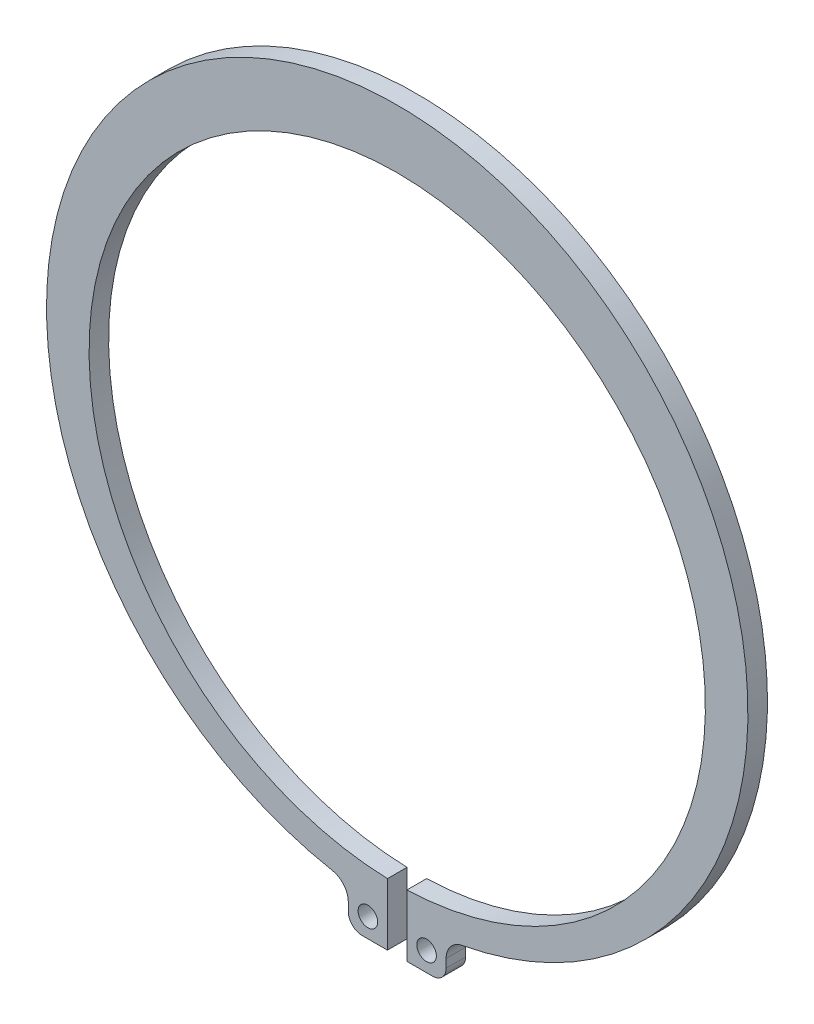
ISO-10303-21;
HEADER;
FILE_DESCRIPTION(('STEP AP214'),'2;1');
FILE_NAME('part.step','',(''),(''),'','','');
FILE_SCHEMA(('AUTOMOTIVE_DESIGN { 1 0 10303 214 1 1 1 1 }'));
ENDSEC;
DATA;
#1=APPLICATION_CONTEXT('core data for automotive mechanical design processes');
#2=APPLICATION_PROTOCOL_DEFINITION('international standard','automotive_design',2000,#1);
#3=PRODUCT_CONTEXT('',#1,'mechanical');
#4=PRODUCT('Part','Part','',(#3));
#5=PRODUCT_RELATED_PRODUCT_CATEGORY('part','',(#4));
#6=PRODUCT_DEFINITION_FORMATION('','',#4);
#7=PRODUCT_DEFINITION_CONTEXT('part definition',#1,'design');
#8=PRODUCT_DEFINITION('design','',#6,#7);
#9=PRODUCT_DEFINITION_SHAPE('','',#8);
#10=(LENGTH_UNIT() NAMED_UNIT(*) SI_UNIT(.MILLI.,.METRE.));
#11=(NAMED_UNIT(*) PLANE_ANGLE_UNIT() SI_UNIT($,.RADIAN.));
#12=(NAMED_UNIT(*) SI_UNIT($,.STERADIAN.) SOLID_ANGLE_UNIT());
#13=UNCERTAINTY_MEASURE_WITH_UNIT(LENGTH_MEASURE(1.E-05),#10,'distance_accuracy_value','');
#14=(GEOMETRIC_REPRESENTATION_CONTEXT(3) GLOBAL_UNCERTAINTY_ASSIGNED_CONTEXT((#13)) GLOBAL_UNIT_ASSIGNED_CONTEXT((#10,
#11,#12)) REPRESENTATION_CONTEXT('',''));
#15=CARTESIAN_POINT('',(0.,0.,0.));
#16=DIRECTION('',(0.,0.,1.));
#17=DIRECTION('',(1.,0.,0.));
#18=AXIS2_PLACEMENT_3D('',#15,#16,#17);
#19=CARTESIAN_POINT('',(0.,0.,3.));
#20=DIRECTION('',(0.,0.,1.));
#21=DIRECTION('',(1.,0.,0.));
#22=AXIS2_PLACEMENT_3D('',#19,#20,#21);
#23=PLANE('',#22);
#24=CARTESIAN_POINT('',(-4.49999999999999,-53.7503017426043,3.));
#25=DIRECTION('',(0.,0.,1.));
#26=DIRECTION('',(1.,0.,0.));
#27=AXIS2_PLACEMENT_3D('',#24,#25,#26);
#28=CIRCLE('',#27,1.5);
#29=CARTESIAN_POINT('',(-2.99999999999999,-53.7503017426043,3.));
#30=VERTEX_POINT('',#29);
#31=EDGE_CURVE('E217',#30,#30,#28,.T.);
#32=ORIENTED_EDGE('',*,*,#31,.F.);
#33=EDGE_LOOP('',(#32));
#34=FACE_BOUND('',#33,.T.);
#35=DIRECTION('',(1.,0.,0.));
#36=VECTOR('',#35,1.);
#37=CARTESIAN_POINT('',(1.50000000000001,-56.7261844742935,3.));
#38=LINE('',#37,#36);
#39=CARTESIAN_POINT('',(1.50000000000001,-56.7261844742935,3.));
#40=VERTEX_POINT('',#39);
#41=CARTESIAN_POINT('',(5.40000000000001,-56.7261844742935,3.));
#42=VERTEX_POINT('',#41);
#43=EDGE_CURVE('E133',#40,#42,#38,.T.);
#44=ORIENTED_EDGE('',*,*,#43,.T.);
#45=CARTESIAN_POINT('',(5.40000000000001,-54.6261844742935,3.));
#46=DIRECTION('',(0.,0.,1.));
#47=DIRECTION('',(1.,0.,0.));
#48=AXIS2_PLACEMENT_3D('',#45,#46,#47);
#49=CIRCLE('',#48,2.1);
#50=CARTESIAN_POINT('',(7.50000000000001,-54.6261844742935,3.));
#51=VERTEX_POINT('',#50);
#52=EDGE_CURVE('E183',#42,#51,#49,.T.);
#53=ORIENTED_EDGE('',*,*,#52,.T.);
#54=DIRECTION('',(0.,1.,0.));
#55=VECTOR('',#54,1.);
#56=CARTESIAN_POINT('',(7.50000000000001,-56.7261844742935,3.));
#57=LINE('',#56,#55);
#58=CARTESIAN_POINT('',(7.50000000000001,-53.320614747039,3.));
#59=VERTEX_POINT('',#58);
#60=EDGE_CURVE('E237',#51,#59,#57,.T.);
#61=ORIENTED_EDGE('',*,*,#60,.T.);
#62=CARTESIAN_POINT('',(10.5,-53.320614747039,3.));
#63=DIRECTION('',(0.,0.,1.));
#64=DIRECTION('',(1.,0.,0.));
#65=AXIS2_PLACEMENT_3D('',#62,#63,#64);
#66=CIRCLE('',#65,3.);
#67=CARTESIAN_POINT('',(9.94517833553502,-50.3723656190581,3.));
#68=VERTEX_POINT('',#67);
#69=EDGE_CURVE('E167',#59,#68,#66,.F.);
#70=ORIENTED_EDGE('',*,*,#69,.T.);
#71=CARTESIAN_POINT('',(0.,2.475,3.));
#72=DIRECTION('',(0.,0.,1.));
#73=DIRECTION('',(1.,0.,0.));
#74=AXIS2_PLACEMENT_3D('',#71,#72,#73);
#75=CIRCLE('',#74,53.775);
#76=CARTESIAN_POINT('',(-9.945178335535,-50.3723656190581,3.));
#77=VERTEX_POINT('',#76);
#78=EDGE_CURVE('E235',#68,#77,#75,.T.);
#79=ORIENTED_EDGE('',*,*,#78,.T.);
#80=CARTESIAN_POINT('',(-10.5,-53.320614747039,3.));
#81=DIRECTION('',(0.,0.,1.));
#82=DIRECTION('',(1.,0.,0.));
#83=AXIS2_PLACEMENT_3D('',#80,#81,#82);
#84=CIRCLE('',#83,3.);
#85=CARTESIAN_POINT('',(-7.5,-53.320614747039,3.));
#86=VERTEX_POINT('',#85);
#87=EDGE_CURVE('E171',#77,#86,#84,.F.);
#88=ORIENTED_EDGE('',*,*,#87,.T.);
#89=DIRECTION('',(0.,-1.,0.));
#90=VECTOR('',#89,1.);
#91=CARTESIAN_POINT('',(-7.5,-56.7261844742935,3.));
#92=LINE('',#91,#90);
#93=CARTESIAN_POINT('',(-7.5,-54.6261844742935,3.));
#94=VERTEX_POINT('',#93);
#95=EDGE_CURVE('E211',#86,#94,#92,.T.);
#96=ORIENTED_EDGE('',*,*,#95,.T.);
#97=CARTESIAN_POINT('',(-5.4,-54.6261844742935,3.));
#98=DIRECTION('',(0.,0.,1.));
#99=DIRECTION('',(1.,0.,0.));
#100=AXIS2_PLACEMENT_3D('',#97,#98,#99);
#101=CIRCLE('',#100,2.1);
#102=CARTESIAN_POINT('',(-5.4,-56.7261844742935,3.));
#103=VERTEX_POINT('',#102);
#104=EDGE_CURVE('E49',#94,#103,#101,.T.);
#105=ORIENTED_EDGE('',*,*,#104,.T.);
#106=DIRECTION('',(1.,0.,0.));
#107=VECTOR('',#106,1.);
#108=CARTESIAN_POINT('',(-1.49999999999999,-56.7261844742935,3.));
#109=LINE('',#108,#107);
#110=CARTESIAN_POINT('',(-1.49999999999999,-56.7261844742935,3.));
#111=VERTEX_POINT('',#110);
#112=EDGE_CURVE('E192',#103,#111,#109,.T.);
#113=ORIENTED_EDGE('',*,*,#112,.T.);
#114=DIRECTION('',(0.,1.,0.));
#115=VECTOR('',#114,1.);
#116=CARTESIAN_POINT('',(-1.49999999999999,-47.2261844742935,3.));
#117=LINE('',#116,#115);
#118=CARTESIAN_POINT('',(-1.49999999999999,-47.2261844742935,3.));
#119=VERTEX_POINT('',#118);
#120=EDGE_CURVE('E139',#111,#119,#117,.T.);
#121=ORIENTED_EDGE('',*,*,#120,.T.);
#122=CARTESIAN_POINT('',(0.,0.,3.));
#123=DIRECTION('',(0.,0.,-1.));
#124=DIRECTION('',(1.,0.,0.));
#125=AXIS2_PLACEMENT_3D('',#122,#123,#124);
#126=CIRCLE('',#125,47.25);
#127=CARTESIAN_POINT('',(1.50000000000001,-47.2261844742935,3.));
#128=VERTEX_POINT('',#127);
#129=EDGE_CURVE('E134',#119,#128,#126,.T.);
#130=ORIENTED_EDGE('',*,*,#129,.T.);
#131=DIRECTION('',(0.,-1.,0.));
#132=VECTOR('',#131,1.);
#133=CARTESIAN_POINT('',(1.50000000000001,-47.2261844742935,3.));
#134=LINE('',#133,#132);
#135=EDGE_CURVE('E123',#128,#40,#134,.T.);
#136=ORIENTED_EDGE('',*,*,#135,.T.);
#137=EDGE_LOOP('',(#44,#53,#61,#70,#79,#88,#96,#105,#113,#121,#130,#136));
#138=FACE_BOUND('',#137,.T.);
#139=CARTESIAN_POINT('',(4.50000000000001,-53.7503017426043,3.));
#140=DIRECTION('',(0.,0.,1.));
#141=DIRECTION('',(-1.,0.,0.));
#142=AXIS2_PLACEMENT_3D('',#139,#140,#141);
#143=CIRCLE('',#142,1.5);
#144=CARTESIAN_POINT('',(3.00000000000001,-53.7503017426043,3.));
#145=VERTEX_POINT('',#144);
#146=EDGE_CURVE('E245',#145,#145,#143,.T.);
#147=ORIENTED_EDGE('',*,*,#146,.F.);
#148=EDGE_LOOP('',(#147));
#149=FACE_BOUND('',#148,.T.);
#150=ADVANCED_FACE('F34',(#34,#138,#149),#23,.T.);
#151=CARTESIAN_POINT('',(0.,0.,0.));
#152=DIRECTION('',(0.,0.,1.));
#153=DIRECTION('',(1.,0.,0.));
#154=AXIS2_PLACEMENT_3D('',#151,#152,#153);
#155=PLANE('',#154);
#156=DIRECTION('',(0.,1.,0.));
#157=VECTOR('',#156,1.);
#158=CARTESIAN_POINT('',(7.50000000000001,-56.7261844742935,0.));
#159=LINE('',#158,#157);
#160=CARTESIAN_POINT('',(7.50000000000001,-54.6261844742935,0.));
#161=VERTEX_POINT('',#160);
#162=CARTESIAN_POINT('',(7.50000000000001,-53.320614747039,0.));
#163=VERTEX_POINT('',#162);
#164=EDGE_CURVE('E222',#161,#163,#159,.T.);
#165=ORIENTED_EDGE('',*,*,#164,.F.);
#166=CARTESIAN_POINT('',(5.40000000000001,-54.6261844742935,0.));
#167=DIRECTION('',(0.,0.,1.));
#168=DIRECTION('',(1.,0.,0.));
#169=AXIS2_PLACEMENT_3D('',#166,#167,#168);
#170=CIRCLE('',#169,2.1);
#171=CARTESIAN_POINT('',(5.40000000000001,-56.7261844742935,0.));
#172=VERTEX_POINT('',#171);
#173=EDGE_CURVE('E178',#161,#172,#170,.F.);
#174=ORIENTED_EDGE('',*,*,#173,.T.);
#175=DIRECTION('',(1.,0.,0.));
#176=VECTOR('',#175,1.);
#177=CARTESIAN_POINT('',(1.50000000000001,-56.7261844742935,0.));
#178=LINE('',#177,#176);
#179=CARTESIAN_POINT('',(1.50000000000001,-56.7261844742935,0.));
#180=VERTEX_POINT('',#179);
#181=EDGE_CURVE('E219',#180,#172,#178,.T.);
#182=ORIENTED_EDGE('',*,*,#181,.F.);
#183=DIRECTION('',(0.,-1.,0.));
#184=VECTOR('',#183,1.);
#185=CARTESIAN_POINT('',(1.50000000000001,-47.2261844742935,0.));
#186=LINE('',#185,#184);
#187=CARTESIAN_POINT('',(1.50000000000001,-47.2261844742935,0.));
#188=VERTEX_POINT('',#187);
#189=EDGE_CURVE('E216',#188,#180,#186,.T.);
#190=ORIENTED_EDGE('',*,*,#189,.F.);
#191=CARTESIAN_POINT('',(0.,0.,0.));
#192=DIRECTION('',(0.,0.,-1.));
#193=DIRECTION('',(1.,0.,0.));
#194=AXIS2_PLACEMENT_3D('',#191,#192,#193);
#195=CIRCLE('',#194,47.25);
#196=CARTESIAN_POINT('',(-1.49999999999999,-47.2261844742935,0.));
#197=VERTEX_POINT('',#196);
#198=EDGE_CURVE('E147',#197,#188,#195,.T.);
#199=ORIENTED_EDGE('',*,*,#198,.F.);
#200=DIRECTION('',(0.,1.,0.));
#201=VECTOR('',#200,1.);
#202=CARTESIAN_POINT('',(-1.49999999999999,-47.2261844742935,0.));
#203=LINE('',#202,#201);
#204=CARTESIAN_POINT('',(-1.49999999999999,-56.7261844742935,0.));
#205=VERTEX_POINT('',#204);
#206=EDGE_CURVE('E143',#205,#197,#203,.T.);
#207=ORIENTED_EDGE('',*,*,#206,.F.);
#208=DIRECTION('',(1.,0.,0.));
#209=VECTOR('',#208,1.);
#210=CARTESIAN_POINT('',(-1.49999999999999,-56.7261844742935,0.));
#211=LINE('',#210,#209);
#212=CARTESIAN_POINT('',(-5.4,-56.7261844742935,0.));
#213=VERTEX_POINT('',#212);
#214=EDGE_CURVE('E190',#213,#205,#211,.T.);
#215=ORIENTED_EDGE('',*,*,#214,.F.);
#216=CARTESIAN_POINT('',(-5.4,-54.6261844742935,0.));
#217=DIRECTION('',(0.,0.,1.));
#218=DIRECTION('',(1.,0.,0.));
#219=AXIS2_PLACEMENT_3D('',#216,#217,#218);
#220=CIRCLE('',#219,2.1);
#221=CARTESIAN_POINT('',(-7.5,-54.6261844742935,0.));
#222=VERTEX_POINT('',#221);
#223=EDGE_CURVE('E176',#213,#222,#220,.F.);
#224=ORIENTED_EDGE('',*,*,#223,.T.);
#225=DIRECTION('',(0.,-1.,0.));
#226=VECTOR('',#225,1.);
#227=CARTESIAN_POINT('',(-7.5,-56.7261844742935,0.));
#228=LINE('',#227,#226);
#229=CARTESIAN_POINT('',(-7.5,-53.320614747039,0.));
#230=VERTEX_POINT('',#229);
#231=EDGE_CURVE('E200',#230,#222,#228,.T.);
#232=ORIENTED_EDGE('',*,*,#231,.F.);
#233=CARTESIAN_POINT('',(-10.5,-53.320614747039,0.));
#234=DIRECTION('',(0.,0.,1.));
#235=DIRECTION('',(1.,0.,0.));
#236=AXIS2_PLACEMENT_3D('',#233,#234,#235);
#237=CIRCLE('',#236,3.);
#238=CARTESIAN_POINT('',(-9.945178335535,-50.3723656190581,0.));
#239=VERTEX_POINT('',#238);
#240=EDGE_CURVE('E169',#230,#239,#237,.T.);
#241=ORIENTED_EDGE('',*,*,#240,.T.);
#242=CARTESIAN_POINT('',(0.,2.475,0.));
#243=DIRECTION('',(0.,0.,1.));
#244=DIRECTION('',(1.,0.,0.));
#245=AXIS2_PLACEMENT_3D('',#242,#243,#244);
#246=CIRCLE('',#245,53.775);
#247=CARTESIAN_POINT('',(9.94517833553502,-50.3723656190581,0.));
#248=VERTEX_POINT('',#247);
#249=EDGE_CURVE('E203',#248,#239,#246,.T.);
#250=ORIENTED_EDGE('',*,*,#249,.F.);
#251=CARTESIAN_POINT('',(10.5,-53.320614747039,0.));
#252=DIRECTION('',(0.,0.,1.));
#253=DIRECTION('',(1.,0.,0.));
#254=AXIS2_PLACEMENT_3D('',#251,#252,#253);
#255=CIRCLE('',#254,3.);
#256=EDGE_CURVE('E164',#248,#163,#255,.T.);
#257=ORIENTED_EDGE('',*,*,#256,.T.);
#258=EDGE_LOOP('',(#165,#174,#182,#190,#199,#207,#215,#224,#232,#241,#250,#257));
#259=FACE_BOUND('',#258,.T.);
#260=CARTESIAN_POINT('',(-4.49999999999999,-53.7503017426043,0.));
#261=DIRECTION('',(0.,0.,1.));
#262=DIRECTION('',(1.,0.,0.));
#263=AXIS2_PLACEMENT_3D('',#260,#261,#262);
#264=CIRCLE('',#263,1.5);
#265=CARTESIAN_POINT('',(-2.99999999999999,-53.7503017426043,0.));
#266=VERTEX_POINT('',#265);
#267=EDGE_CURVE('E242',#266,#266,#264,.T.);
#268=ORIENTED_EDGE('',*,*,#267,.T.);
#269=EDGE_LOOP('',(#268));
#270=FACE_BOUND('',#269,.T.);
#271=CARTESIAN_POINT('',(4.50000000000001,-53.7503017426043,0.));
#272=DIRECTION('',(0.,0.,1.));
#273=DIRECTION('',(-1.,0.,0.));
#274=AXIS2_PLACEMENT_3D('',#271,#272,#273);
#275=CIRCLE('',#274,1.5);
#276=CARTESIAN_POINT('',(3.00000000000001,-53.7503017426043,0.));
#277=VERTEX_POINT('',#276);
#278=EDGE_CURVE('E248',#277,#277,#275,.T.);
#279=ORIENTED_EDGE('',*,*,#278,.T.);
#280=EDGE_LOOP('',(#279));
#281=FACE_BOUND('',#280,.T.);
#282=ADVANCED_FACE('F197',(#259,#270,#281),#155,.F.);
#283=CARTESIAN_POINT('',(0.,0.,3.));
#284=DIRECTION('',(0.,0.,-1.));
#285=DIRECTION('',(-1.,0.,0.));
#286=AXIS2_PLACEMENT_3D('',#283,#284,#285);
#287=CYLINDRICAL_SURFACE('',#286,47.25);
#288=ORIENTED_EDGE('',*,*,#198,.T.);
#289=DIRECTION('',(0.,0.,-1.));
#290=VECTOR('',#289,1.);
#291=CARTESIAN_POINT('',(1.50000000000001,-47.2261844742935,3.));
#292=LINE('',#291,#290);
#293=EDGE_CURVE('E127',#128,#188,#292,.T.);
#294=ORIENTED_EDGE('',*,*,#293,.F.);
#295=ORIENTED_EDGE('',*,*,#129,.F.);
#296=DIRECTION('',(0.,0.,-1.));
#297=VECTOR('',#296,1.);
#298=CARTESIAN_POINT('',(-1.49999999999999,-47.2261844742935,3.));
#299=LINE('',#298,#297);
#300=EDGE_CURVE('E207',#119,#197,#299,.T.);
#301=ORIENTED_EDGE('',*,*,#300,.T.);
#302=EDGE_LOOP('',(#288,#294,#295,#301));
#303=FACE_BOUND('',#302,.T.);
#304=ADVANCED_FACE('F145',(#303),#287,.F.);
#305=CARTESIAN_POINT('',(1.50000000000001,-47.2261844742935,3.));
#306=DIRECTION('',(1.,0.,0.));
#307=DIRECTION('',(0.,1.,0.));
#308=AXIS2_PLACEMENT_3D('',#305,#306,#307);
#309=PLANE('',#308);
#310=ORIENTED_EDGE('',*,*,#189,.T.);
#311=DIRECTION('',(0.,0.,-1.));
#312=VECTOR('',#311,1.);
#313=CARTESIAN_POINT('',(1.50000000000001,-56.7261844742935,3.));
#314=LINE('',#313,#312);
#315=EDGE_CURVE('E130',#40,#180,#314,.T.);
#316=ORIENTED_EDGE('',*,*,#315,.F.);
#317=ORIENTED_EDGE('',*,*,#135,.F.);
#318=ORIENTED_EDGE('',*,*,#293,.T.);
#319=EDGE_LOOP('',(#310,#316,#317,#318));
#320=FACE_BOUND('',#319,.T.);
#321=ADVANCED_FACE('F125',(#320),#309,.F.);
#322=CARTESIAN_POINT('',(1.50000000000001,-56.7261844742935,3.));
#323=DIRECTION('',(0.,1.,0.));
#324=DIRECTION('',(-1.,0.,0.));
#325=AXIS2_PLACEMENT_3D('',#322,#323,#324);
#326=PLANE('',#325);
#327=ORIENTED_EDGE('',*,*,#181,.T.);
#328=DIRECTION('',(0.,0.,-1.));
#329=VECTOR('',#328,1.);
#330=CARTESIAN_POINT('',(5.40000000000001,-56.7261844742935,3.));
#331=LINE('',#330,#329);
#332=EDGE_CURVE('E180',#172,#42,#331,.F.);
#333=ORIENTED_EDGE('',*,*,#332,.T.);
#334=ORIENTED_EDGE('',*,*,#43,.F.);
#335=ORIENTED_EDGE('',*,*,#315,.T.);
#336=EDGE_LOOP('',(#327,#333,#334,#335));
#337=FACE_BOUND('',#336,.T.);
#338=ADVANCED_FACE('F279',(#337),#326,.F.);
#339=CARTESIAN_POINT('',(7.50000000000001,-56.7261844742935,3.));
#340=DIRECTION('',(-1.,0.,0.));
#341=DIRECTION('',(0.,-1.,0.));
#342=AXIS2_PLACEMENT_3D('',#339,#340,#341);
#343=PLANE('',#342);
#344=ORIENTED_EDGE('',*,*,#60,.F.);
#345=DIRECTION('',(0.,0.,-1.));
#346=VECTOR('',#345,1.);
#347=CARTESIAN_POINT('',(7.50000000000001,-54.6261844742935,3.));
#348=LINE('',#347,#346);
#349=EDGE_CURVE('E173',#51,#161,#348,.T.);
#350=ORIENTED_EDGE('',*,*,#349,.T.);
#351=ORIENTED_EDGE('',*,*,#164,.T.);
#352=DIRECTION('',(0.,0.,1.));
#353=VECTOR('',#352,1.);
#354=CARTESIAN_POINT('',(7.50000000000001,-53.320614747039,3.));
#355=LINE('',#354,#353);
#356=EDGE_CURVE('E158',#163,#59,#355,.T.);
#357=ORIENTED_EDGE('',*,*,#356,.T.);
#358=EDGE_LOOP('',(#344,#350,#351,#357));
#359=FACE_BOUND('',#358,.T.);
#360=ADVANCED_FACE('F276',(#359),#343,.F.);
#361=CARTESIAN_POINT('',(0.,2.475,3.));
#362=DIRECTION('',(0.,0.,-1.));
#363=DIRECTION('',(-1.,0.,0.));
#364=AXIS2_PLACEMENT_3D('',#361,#362,#363);
#365=CYLINDRICAL_SURFACE('',#364,53.775);
#366=ORIENTED_EDGE('',*,*,#78,.F.);
#367=DIRECTION('',(0.,0.,-1.));
#368=VECTOR('',#367,1.);
#369=CARTESIAN_POINT('',(9.94517833553502,-50.3723656190581,3.));
#370=LINE('',#369,#368);
#371=EDGE_CURVE('E150',#68,#248,#370,.T.);
#372=ORIENTED_EDGE('',*,*,#371,.T.);
#373=ORIENTED_EDGE('',*,*,#249,.T.);
#374=DIRECTION('',(0.,0.,-1.));
#375=VECTOR('',#374,1.);
#376=CARTESIAN_POINT('',(-9.945178335535,-50.3723656190581,3.));
#377=LINE('',#376,#375);
#378=EDGE_CURVE('E148',#239,#77,#377,.F.);
#379=ORIENTED_EDGE('',*,*,#378,.T.);
#380=EDGE_LOOP('',(#366,#372,#373,#379));
#381=FACE_BOUND('',#380,.T.);
#382=ADVANCED_FACE('F228',(#381),#365,.T.);
#383=CARTESIAN_POINT('',(-7.5,-56.7261844742935,3.));
#384=DIRECTION('',(1.,0.,0.));
#385=DIRECTION('',(0.,1.,0.));
#386=AXIS2_PLACEMENT_3D('',#383,#384,#385);
#387=PLANE('',#386);
#388=ORIENTED_EDGE('',*,*,#231,.T.);
#389=DIRECTION('',(0.,0.,-1.));
#390=VECTOR('',#389,1.);
#391=CARTESIAN_POINT('',(-7.5,-54.6261844742935,3.));
#392=LINE('',#391,#390);
#393=EDGE_CURVE('E11',#222,#94,#392,.F.);
#394=ORIENTED_EDGE('',*,*,#393,.T.);
#395=ORIENTED_EDGE('',*,*,#95,.F.);
#396=DIRECTION('',(0.,0.,1.));
#397=VECTOR('',#396,1.);
#398=CARTESIAN_POINT('',(-7.5,-53.320614747039,0.));
#399=LINE('',#398,#397);
#400=EDGE_CURVE('E161',#86,#230,#399,.F.);
#401=ORIENTED_EDGE('',*,*,#400,.T.);
#402=EDGE_LOOP('',(#388,#394,#395,#401));
#403=FACE_BOUND('',#402,.T.);
#404=ADVANCED_FACE('F236',(#403),#387,.F.);
#405=CARTESIAN_POINT('',(-1.49999999999999,-56.7261844742935,3.));
#406=DIRECTION('',(0.,1.,0.));
#407=DIRECTION('',(0.,0.,1.));
#408=AXIS2_PLACEMENT_3D('',#405,#406,#407);
#409=PLANE('',#408);
#410=ORIENTED_EDGE('',*,*,#112,.F.);
#411=DIRECTION('',(0.,0.,-1.));
#412=VECTOR('',#411,1.);
#413=CARTESIAN_POINT('',(-5.4,-56.7261844742935,3.));
#414=LINE('',#413,#412);
#415=EDGE_CURVE('E42',#103,#213,#414,.T.);
#416=ORIENTED_EDGE('',*,*,#415,.T.);
#417=ORIENTED_EDGE('',*,*,#214,.T.);
#418=DIRECTION('',(0.,0.,-1.));
#419=VECTOR('',#418,1.);
#420=CARTESIAN_POINT('',(-1.49999999999999,-56.7261844742935,3.));
#421=LINE('',#420,#419);
#422=EDGE_CURVE('E152',#111,#205,#421,.T.);
#423=ORIENTED_EDGE('',*,*,#422,.F.);
#424=EDGE_LOOP('',(#410,#416,#417,#423));
#425=FACE_BOUND('',#424,.T.);
#426=ADVANCED_FACE('F188',(#425),#409,.F.);
#427=CARTESIAN_POINT('',(-1.49999999999999,-47.2261844742935,3.));
#428=DIRECTION('',(-1.,0.,0.));
#429=DIRECTION('',(0.,-1.,0.));
#430=AXIS2_PLACEMENT_3D('',#427,#428,#429);
#431=PLANE('',#430);
#432=ORIENTED_EDGE('',*,*,#206,.T.);
#433=ORIENTED_EDGE('',*,*,#300,.F.);
#434=ORIENTED_EDGE('',*,*,#120,.F.);
#435=ORIENTED_EDGE('',*,*,#422,.T.);
#436=EDGE_LOOP('',(#432,#433,#434,#435));
#437=FACE_BOUND('',#436,.T.);
#438=ADVANCED_FACE('F209',(#437),#431,.F.);
#439=CARTESIAN_POINT('',(-4.49999999999999,-53.7503017426043,3.));
#440=DIRECTION('',(0.,0.,-1.));
#441=DIRECTION('',(-1.,0.,0.));
#442=AXIS2_PLACEMENT_3D('',#439,#440,#441);
#443=CYLINDRICAL_SURFACE('',#442,1.5);
#444=ORIENTED_EDGE('',*,*,#31,.T.);
#445=EDGE_LOOP('',(#444));
#446=FACE_BOUND('',#445,.T.);
#447=ORIENTED_EDGE('',*,*,#267,.F.);
#448=EDGE_LOOP('',(#447));
#449=FACE_BOUND('',#448,.T.);
#450=ADVANCED_FACE('F265',(#446,#449),#443,.F.);
#451=CARTESIAN_POINT('',(4.50000000000001,-53.7503017426043,3.));
#452=DIRECTION('',(0.,0.,-1.));
#453=DIRECTION('',(-1.,0.,0.));
#454=AXIS2_PLACEMENT_3D('',#451,#452,#453);
#455=CYLINDRICAL_SURFACE('',#454,1.5);
#456=ORIENTED_EDGE('',*,*,#146,.T.);
#457=EDGE_LOOP('',(#456));
#458=FACE_BOUND('',#457,.T.);
#459=ORIENTED_EDGE('',*,*,#278,.F.);
#460=EDGE_LOOP('',(#459));
#461=FACE_BOUND('',#460,.T.);
#462=ADVANCED_FACE('F254',(#458,#461),#455,.F.);
#463=CARTESIAN_POINT('',(10.5,-53.320614747039,3.));
#464=DIRECTION('',(0.,0.,-1.));
#465=DIRECTION('',(-1.,0.,0.));
#466=AXIS2_PLACEMENT_3D('',#463,#464,#465);
#467=CYLINDRICAL_SURFACE('',#466,3.);
#468=ORIENTED_EDGE('',*,*,#69,.F.);
#469=ORIENTED_EDGE('',*,*,#356,.F.);
#470=ORIENTED_EDGE('',*,*,#256,.F.);
#471=ORIENTED_EDGE('',*,*,#371,.F.);
#472=EDGE_LOOP('',(#468,#469,#470,#471));
#473=FACE_BOUND('',#472,.T.);
#474=ADVANCED_FACE('F288',(#473),#467,.F.);
#475=CARTESIAN_POINT('',(-10.5,-53.320614747039,3.));
#476=DIRECTION('',(0.,0.,-1.));
#477=DIRECTION('',(-1.,0.,0.));
#478=AXIS2_PLACEMENT_3D('',#475,#476,#477);
#479=CYLINDRICAL_SURFACE('',#478,3.);
#480=ORIENTED_EDGE('',*,*,#87,.F.);
#481=ORIENTED_EDGE('',*,*,#378,.F.);
#482=ORIENTED_EDGE('',*,*,#240,.F.);
#483=ORIENTED_EDGE('',*,*,#400,.F.);
#484=EDGE_LOOP('',(#480,#481,#482,#483));
#485=FACE_BOUND('',#484,.T.);
#486=ADVANCED_FACE('F233',(#485),#479,.F.);
#487=CARTESIAN_POINT('',(5.40000000000001,-54.6261844742935,3.));
#488=DIRECTION('',(0.,0.,-1.));
#489=DIRECTION('',(-1.,0.,0.));
#490=AXIS2_PLACEMENT_3D('',#487,#488,#489);
#491=CYLINDRICAL_SURFACE('',#490,2.1);
#492=ORIENTED_EDGE('',*,*,#52,.F.);
#493=ORIENTED_EDGE('',*,*,#332,.F.);
#494=ORIENTED_EDGE('',*,*,#173,.F.);
#495=ORIENTED_EDGE('',*,*,#349,.F.);
#496=EDGE_LOOP('',(#492,#493,#494,#495));
#497=FACE_BOUND('',#496,.T.);
#498=ADVANCED_FACE('F293',(#497),#491,.T.);
#499=CARTESIAN_POINT('',(-5.4,-54.6261844742935,3.));
#500=DIRECTION('',(0.,0.,-1.));
#501=DIRECTION('',(-1.,0.,0.));
#502=AXIS2_PLACEMENT_3D('',#499,#500,#501);
#503=CYLINDRICAL_SURFACE('',#502,2.1);
#504=ORIENTED_EDGE('',*,*,#104,.F.);
#505=ORIENTED_EDGE('',*,*,#393,.F.);
#506=ORIENTED_EDGE('',*,*,#223,.F.);
#507=ORIENTED_EDGE('',*,*,#415,.F.);
#508=EDGE_LOOP('',(#504,#505,#506,#507));
#509=FACE_BOUND('',#508,.T.);
#510=ADVANCED_FACE('F36',(#509),#503,.T.);
#511=CLOSED_SHELL('',(#150,#282,#304,#321,#338,#360,#382,#404,#426,#438,#450,#462,#474,#486,
#498,#510));
#512=MANIFOLD_SOLID_BREP('B2',#511);
#513=ADVANCED_BREP_SHAPE_REPRESENTATION('',(#18,#512),#14);
#514=SHAPE_DEFINITION_REPRESENTATION(#9,#513);
ENDSEC;
END-ISO-10303-21;
